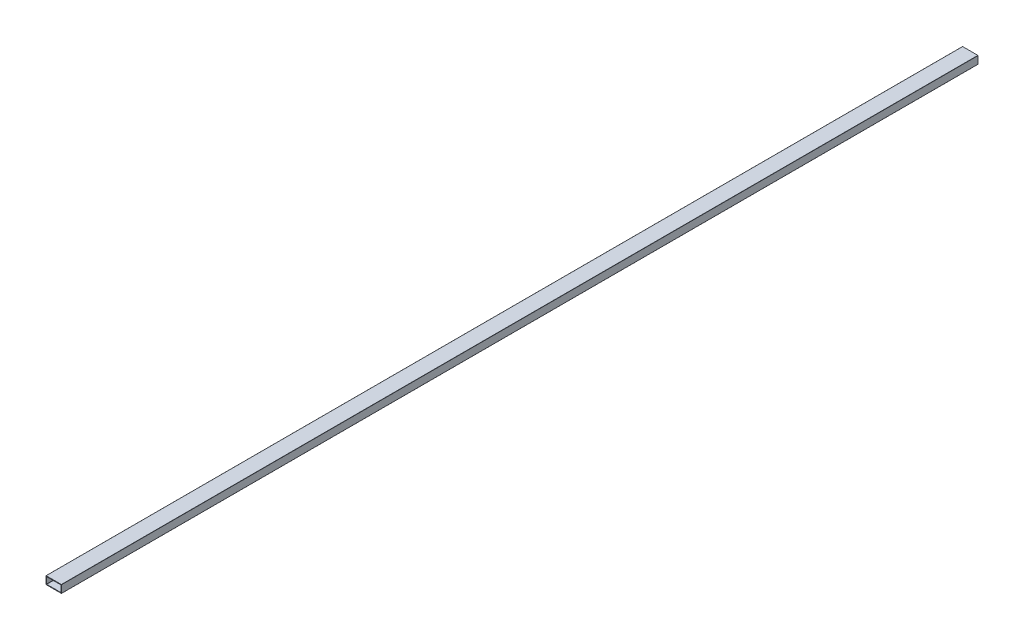
ISO-10303-21;
HEADER;
FILE_DESCRIPTION(('STEP AP214'),'2;1');
FILE_NAME('part.step','',(''),(''),'','','');
FILE_SCHEMA(('AUTOMOTIVE_DESIGN { 1 0 10303 214 1 1 1 1 }'));
ENDSEC;
DATA;
#1=APPLICATION_CONTEXT('core data for automotive mechanical design processes');
#2=APPLICATION_PROTOCOL_DEFINITION('international standard','automotive_design',2000,#1);
#3=PRODUCT_CONTEXT('',#1,'mechanical');
#4=PRODUCT('Part','Part','',(#3));
#5=PRODUCT_RELATED_PRODUCT_CATEGORY('part','',(#4));
#6=PRODUCT_DEFINITION_FORMATION('','',#4);
#7=PRODUCT_DEFINITION_CONTEXT('part definition',#1,'design');
#8=PRODUCT_DEFINITION('design','',#6,#7);
#9=PRODUCT_DEFINITION_SHAPE('','',#8);
#10=(LENGTH_UNIT() NAMED_UNIT(*) SI_UNIT(.MILLI.,.METRE.));
#11=(NAMED_UNIT(*) PLANE_ANGLE_UNIT() SI_UNIT($,.RADIAN.));
#12=(NAMED_UNIT(*) SI_UNIT($,.STERADIAN.) SOLID_ANGLE_UNIT());
#13=UNCERTAINTY_MEASURE_WITH_UNIT(LENGTH_MEASURE(1.E-05),#10,'distance_accuracy_value','');
#14=(GEOMETRIC_REPRESENTATION_CONTEXT(3) GLOBAL_UNCERTAINTY_ASSIGNED_CONTEXT((#13)) GLOBAL_UNIT_ASSIGNED_CONTEXT((#10,
#11,#12)) REPRESENTATION_CONTEXT('',''));
#15=CARTESIAN_POINT('',(0.,0.,0.));
#16=DIRECTION('',(0.,0.,1.));
#17=DIRECTION('',(1.,0.,0.));
#18=AXIS2_PLACEMENT_3D('',#15,#16,#17);
#19=CARTESIAN_POINT('',(50.8,-25.4,-6000.));
#20=DIRECTION('',(1.,0.,0.));
#21=DIRECTION('',(0.,0.,-1.));
#22=AXIS2_PLACEMENT_3D('',#19,#20,#21);
#23=PLANE('',#22);
#24=DIRECTION('',(0.,1.,0.));
#25=VECTOR('',#24,1.);
#26=CARTESIAN_POINT('',(50.8,-25.4,0.));
#27=LINE('',#26,#25);
#28=CARTESIAN_POINT('',(50.8,-24.4,0.));
#29=VERTEX_POINT('',#28);
#30=CARTESIAN_POINT('',(50.8,24.4,0.));
#31=VERTEX_POINT('',#30);
#32=EDGE_CURVE('E197',#29,#31,#27,.T.);
#33=ORIENTED_EDGE('',*,*,#32,.F.);
#34=DIRECTION('',(0.,0.,1.));
#35=VECTOR('',#34,1.);
#36=CARTESIAN_POINT('',(50.8,-24.4,-6000.));
#37=LINE('',#36,#35);
#38=CARTESIAN_POINT('',(50.8,-24.4,-6000.));
#39=VERTEX_POINT('',#38);
#40=EDGE_CURVE('E158',#29,#39,#37,.F.);
#41=ORIENTED_EDGE('',*,*,#40,.T.);
#42=DIRECTION('',(0.,1.,0.));
#43=VECTOR('',#42,1.);
#44=CARTESIAN_POINT('',(50.8,-25.4,-6000.));
#45=LINE('',#44,#43);
#46=CARTESIAN_POINT('',(50.8,24.4,-6000.));
#47=VERTEX_POINT('',#46);
#48=EDGE_CURVE('E185',#39,#47,#45,.T.);
#49=ORIENTED_EDGE('',*,*,#48,.T.);
#50=DIRECTION('',(0.,0.,1.));
#51=VECTOR('',#50,1.);
#52=CARTESIAN_POINT('',(50.8,24.4,-6000.));
#53=LINE('',#52,#51);
#54=EDGE_CURVE('E251',#47,#31,#53,.T.);
#55=ORIENTED_EDGE('',*,*,#54,.T.);
#56=EDGE_LOOP('',(#33,#41,#49,#55));
#57=FACE_BOUND('',#56,.T.);
#58=ADVANCED_FACE('F33',(#57),#23,.T.);
#59=CARTESIAN_POINT('',(-50.8,-25.4,-6000.));
#60=DIRECTION('',(0.,-1.,0.));
#61=DIRECTION('',(0.,0.,-1.));
#62=AXIS2_PLACEMENT_3D('',#59,#60,#61);
#63=PLANE('',#62);
#64=DIRECTION('',(1.,0.,0.));
#65=VECTOR('',#64,1.);
#66=CARTESIAN_POINT('',(-50.8,-25.4,0.));
#67=LINE('',#66,#65);
#68=CARTESIAN_POINT('',(-49.8,-25.4,0.));
#69=VERTEX_POINT('',#68);
#70=CARTESIAN_POINT('',(49.8,-25.4,0.));
#71=VERTEX_POINT('',#70);
#72=EDGE_CURVE('E189',#69,#71,#67,.T.);
#73=ORIENTED_EDGE('',*,*,#72,.F.);
#74=DIRECTION('',(0.,0.,1.));
#75=VECTOR('',#74,1.);
#76=CARTESIAN_POINT('',(-49.8,-25.4,-6000.));
#77=LINE('',#76,#75);
#78=CARTESIAN_POINT('',(-49.8,-25.4,-6000.));
#79=VERTEX_POINT('',#78);
#80=EDGE_CURVE('E238',#69,#79,#77,.F.);
#81=ORIENTED_EDGE('',*,*,#80,.T.);
#82=DIRECTION('',(1.,0.,0.));
#83=VECTOR('',#82,1.);
#84=CARTESIAN_POINT('',(-50.8,-25.4,-6000.));
#85=LINE('',#84,#83);
#86=CARTESIAN_POINT('',(49.8,-25.4,-6000.));
#87=VERTEX_POINT('',#86);
#88=EDGE_CURVE('E194',#79,#87,#85,.T.);
#89=ORIENTED_EDGE('',*,*,#88,.T.);
#90=DIRECTION('',(0.,0.,1.));
#91=VECTOR('',#90,1.);
#92=CARTESIAN_POINT('',(49.8,-25.4,-6000.));
#93=LINE('',#92,#91);
#94=EDGE_CURVE('E235',#87,#71,#93,.T.);
#95=ORIENTED_EDGE('',*,*,#94,.T.);
#96=EDGE_LOOP('',(#73,#81,#89,#95));
#97=FACE_BOUND('',#96,.T.);
#98=ADVANCED_FACE('F305',(#97),#63,.T.);
#99=CARTESIAN_POINT('',(-50.8,-25.4,-6000.));
#100=DIRECTION('',(-1.,0.,0.));
#101=DIRECTION('',(0.,0.,1.));
#102=AXIS2_PLACEMENT_3D('',#99,#100,#101);
#103=PLANE('',#102);
#104=DIRECTION('',(0.,-1.,0.));
#105=VECTOR('',#104,1.);
#106=CARTESIAN_POINT('',(-50.8,-25.4,-6000.));
#107=LINE('',#106,#105);
#108=CARTESIAN_POINT('',(-50.8,24.4,-6000.));
#109=VERTEX_POINT('',#108);
#110=CARTESIAN_POINT('',(-50.8,-24.4,-6000.));
#111=VERTEX_POINT('',#110);
#112=EDGE_CURVE('E191',#109,#111,#107,.T.);
#113=ORIENTED_EDGE('',*,*,#112,.T.);
#114=DIRECTION('',(0.,0.,1.));
#115=VECTOR('',#114,1.);
#116=CARTESIAN_POINT('',(-50.8,-24.4,-6000.));
#117=LINE('',#116,#115);
#118=CARTESIAN_POINT('',(-50.8,-24.4,0.));
#119=VERTEX_POINT('',#118);
#120=EDGE_CURVE('E224',#111,#119,#117,.T.);
#121=ORIENTED_EDGE('',*,*,#120,.T.);
#122=DIRECTION('',(0.,-1.,0.));
#123=VECTOR('',#122,1.);
#124=CARTESIAN_POINT('',(-50.8,-25.4,0.));
#125=LINE('',#124,#123);
#126=CARTESIAN_POINT('',(-50.8,24.4,0.));
#127=VERTEX_POINT('',#126);
#128=EDGE_CURVE('E203',#127,#119,#125,.T.);
#129=ORIENTED_EDGE('',*,*,#128,.F.);
#130=DIRECTION('',(0.,0.,1.));
#131=VECTOR('',#130,1.);
#132=CARTESIAN_POINT('',(-50.8,24.4,-6000.));
#133=LINE('',#132,#131);
#134=EDGE_CURVE('E222',#127,#109,#133,.F.);
#135=ORIENTED_EDGE('',*,*,#134,.T.);
#136=EDGE_LOOP('',(#113,#121,#129,#135));
#137=FACE_BOUND('',#136,.T.);
#138=ADVANCED_FACE('F311',(#137),#103,.T.);
#139=CARTESIAN_POINT('',(-50.8,25.4,-6000.));
#140=DIRECTION('',(0.,1.,0.));
#141=DIRECTION('',(0.,0.,1.));
#142=AXIS2_PLACEMENT_3D('',#139,#140,#141);
#143=PLANE('',#142);
#144=DIRECTION('',(-1.,0.,0.));
#145=VECTOR('',#144,1.);
#146=CARTESIAN_POINT('',(-50.8,25.4,-6000.));
#147=LINE('',#146,#145);
#148=CARTESIAN_POINT('',(49.8,25.4,-6000.));
#149=VERTEX_POINT('',#148);
#150=CARTESIAN_POINT('',(-49.8,25.4,-6000.));
#151=VERTEX_POINT('',#150);
#152=EDGE_CURVE('E188',#149,#151,#147,.T.);
#153=ORIENTED_EDGE('',*,*,#152,.T.);
#154=DIRECTION('',(0.,0.,1.));
#155=VECTOR('',#154,1.);
#156=CARTESIAN_POINT('',(-49.8,25.4,-6000.));
#157=LINE('',#156,#155);
#158=CARTESIAN_POINT('',(-49.8,25.4,0.));
#159=VERTEX_POINT('',#158);
#160=EDGE_CURVE('E248',#151,#159,#157,.T.);
#161=ORIENTED_EDGE('',*,*,#160,.T.);
#162=DIRECTION('',(-1.,0.,0.));
#163=VECTOR('',#162,1.);
#164=CARTESIAN_POINT('',(-50.8,25.4,0.));
#165=LINE('',#164,#163);
#166=CARTESIAN_POINT('',(49.8,25.4,0.));
#167=VERTEX_POINT('',#166);
#168=EDGE_CURVE('E200',#167,#159,#165,.T.);
#169=ORIENTED_EDGE('',*,*,#168,.F.);
#170=DIRECTION('',(0.,0.,1.));
#171=VECTOR('',#170,1.);
#172=CARTESIAN_POINT('',(49.8,25.4,-6000.));
#173=LINE('',#172,#171);
#174=EDGE_CURVE('E55',#167,#149,#173,.F.);
#175=ORIENTED_EDGE('',*,*,#174,.T.);
#176=EDGE_LOOP('',(#153,#161,#169,#175));
#177=FACE_BOUND('',#176,.T.);
#178=ADVANCED_FACE('F316',(#177),#143,.T.);
#179=CARTESIAN_POINT('',(0.,0.,-6000.));
#180=DIRECTION('',(0.,0.,-1.));
#181=DIRECTION('',(-1.,0.,0.));
#182=AXIS2_PLACEMENT_3D('',#179,#180,#181);
#183=PLANE('',#182);
#184=DIRECTION('',(0.,-1.,0.));
#185=VECTOR('',#184,1.);
#186=CARTESIAN_POINT('',(-47.,-21.6,-6000.));
#187=LINE('',#186,#185);
#188=CARTESIAN_POINT('',(-47.,20.6,-6000.));
#189=VERTEX_POINT('',#188);
#190=CARTESIAN_POINT('',(-47.,-20.6,-6000.));
#191=VERTEX_POINT('',#190);
#192=EDGE_CURVE('E167',#189,#191,#187,.T.);
#193=ORIENTED_EDGE('',*,*,#192,.T.);
#194=CARTESIAN_POINT('',(-46.,-20.6,-6000.));
#195=DIRECTION('',(0.,0.,-1.));
#196=DIRECTION('',(-1.,0.,0.));
#197=AXIS2_PLACEMENT_3D('',#194,#195,#196);
#198=CIRCLE('',#197,1.);
#199=CARTESIAN_POINT('',(-46.,-21.6,-6000.));
#200=VERTEX_POINT('',#199);
#201=EDGE_CURVE('E11',#191,#200,#198,.F.);
#202=ORIENTED_EDGE('',*,*,#201,.T.);
#203=DIRECTION('',(1.,0.,0.));
#204=VECTOR('',#203,1.);
#205=CARTESIAN_POINT('',(-47.,-21.6,-6000.));
#206=LINE('',#205,#204);
#207=CARTESIAN_POINT('',(46.,-21.6,-6000.));
#208=VERTEX_POINT('',#207);
#209=EDGE_CURVE('E175',#200,#208,#206,.T.);
#210=ORIENTED_EDGE('',*,*,#209,.T.);
#211=CARTESIAN_POINT('',(46.,-20.6,-6000.));
#212=DIRECTION('',(0.,0.,-1.));
#213=DIRECTION('',(-1.,0.,0.));
#214=AXIS2_PLACEMENT_3D('',#211,#212,#213);
#215=CIRCLE('',#214,1.);
#216=CARTESIAN_POINT('',(47.,-20.6,-6000.));
#217=VERTEX_POINT('',#216);
#218=EDGE_CURVE('E262',#208,#217,#215,.F.);
#219=ORIENTED_EDGE('',*,*,#218,.T.);
#220=DIRECTION('',(0.,1.,0.));
#221=VECTOR('',#220,1.);
#222=CARTESIAN_POINT('',(47.,-21.6,-6000.));
#223=LINE('',#222,#221);
#224=CARTESIAN_POINT('',(47.,20.6,-6000.));
#225=VERTEX_POINT('',#224);
#226=EDGE_CURVE('E179',#217,#225,#223,.T.);
#227=ORIENTED_EDGE('',*,*,#226,.T.);
#228=CARTESIAN_POINT('',(46.,20.6,-6000.));
#229=DIRECTION('',(0.,0.,-1.));
#230=DIRECTION('',(-1.,0.,0.));
#231=AXIS2_PLACEMENT_3D('',#228,#229,#230);
#232=CIRCLE('',#231,1.);
#233=CARTESIAN_POINT('',(46.,21.6,-6000.));
#234=VERTEX_POINT('',#233);
#235=EDGE_CURVE('E258',#225,#234,#232,.F.);
#236=ORIENTED_EDGE('',*,*,#235,.T.);
#237=DIRECTION('',(-1.,0.,0.));
#238=VECTOR('',#237,1.);
#239=CARTESIAN_POINT('',(-47.,21.6,-6000.));
#240=LINE('',#239,#238);
#241=CARTESIAN_POINT('',(-46.,21.6,-6000.));
#242=VERTEX_POINT('',#241);
#243=EDGE_CURVE('E277',#234,#242,#240,.T.);
#244=ORIENTED_EDGE('',*,*,#243,.T.);
#245=CARTESIAN_POINT('',(-46.,20.6,-6000.));
#246=DIRECTION('',(0.,0.,-1.));
#247=DIRECTION('',(-1.,0.,0.));
#248=AXIS2_PLACEMENT_3D('',#245,#246,#247);
#249=CIRCLE('',#248,1.);
#250=EDGE_CURVE('E157',#242,#189,#249,.F.);
#251=ORIENTED_EDGE('',*,*,#250,.T.);
#252=EDGE_LOOP('',(#193,#202,#210,#219,#227,#236,#244,#251));
#253=FACE_BOUND('',#252,.T.);
#254=ORIENTED_EDGE('',*,*,#88,.F.);
#255=CARTESIAN_POINT('',(-49.8,-24.4,-6000.));
#256=DIRECTION('',(0.,0.,-1.));
#257=DIRECTION('',(-1.,0.,0.));
#258=AXIS2_PLACEMENT_3D('',#255,#256,#257);
#259=CIRCLE('',#258,1.);
#260=EDGE_CURVE('E245',#79,#111,#259,.T.);
#261=ORIENTED_EDGE('',*,*,#260,.T.);
#262=ORIENTED_EDGE('',*,*,#112,.F.);
#263=CARTESIAN_POINT('',(-49.8,24.4,-6000.));
#264=DIRECTION('',(0.,0.,-1.));
#265=DIRECTION('',(-1.,0.,0.));
#266=AXIS2_PLACEMENT_3D('',#263,#264,#265);
#267=CIRCLE('',#266,1.);
#268=EDGE_CURVE('E48',#109,#151,#267,.T.);
#269=ORIENTED_EDGE('',*,*,#268,.T.);
#270=ORIENTED_EDGE('',*,*,#152,.F.);
#271=CARTESIAN_POINT('',(49.8,24.4,-6000.));
#272=DIRECTION('',(0.,0.,-1.));
#273=DIRECTION('',(-1.,0.,0.));
#274=AXIS2_PLACEMENT_3D('',#271,#272,#273);
#275=CIRCLE('',#274,1.);
#276=EDGE_CURVE('E240',#149,#47,#275,.T.);
#277=ORIENTED_EDGE('',*,*,#276,.T.);
#278=ORIENTED_EDGE('',*,*,#48,.F.);
#279=CARTESIAN_POINT('',(49.8,-24.4,-6000.));
#280=DIRECTION('',(0.,0.,-1.));
#281=DIRECTION('',(-1.,0.,0.));
#282=AXIS2_PLACEMENT_3D('',#279,#280,#281);
#283=CIRCLE('',#282,1.);
#284=EDGE_CURVE('E242',#39,#87,#283,.T.);
#285=ORIENTED_EDGE('',*,*,#284,.T.);
#286=EDGE_LOOP('',(#254,#261,#262,#269,#270,#277,#278,#285));
#287=FACE_BOUND('',#286,.T.);
#288=ADVANCED_FACE('F267',(#253,#287),#183,.T.);
#289=CARTESIAN_POINT('',(0.,0.,0.));
#290=DIRECTION('',(0.,0.,-1.));
#291=DIRECTION('',(-1.,0.,0.));
#292=AXIS2_PLACEMENT_3D('',#289,#290,#291);
#293=PLANE('',#292);
#294=DIRECTION('',(0.,1.,0.));
#295=VECTOR('',#294,1.);
#296=CARTESIAN_POINT('',(47.,-21.6,0.));
#297=LINE('',#296,#295);
#298=CARTESIAN_POINT('',(47.,-20.6,0.));
#299=VERTEX_POINT('',#298);
#300=CARTESIAN_POINT('',(47.,20.6,0.));
#301=VERTEX_POINT('',#300);
#302=EDGE_CURVE('E181',#299,#301,#297,.T.);
#303=ORIENTED_EDGE('',*,*,#302,.F.);
#304=CARTESIAN_POINT('',(46.,-20.6,0.));
#305=DIRECTION('',(0.,0.,-1.));
#306=DIRECTION('',(-1.,0.,0.));
#307=AXIS2_PLACEMENT_3D('',#304,#305,#306);
#308=CIRCLE('',#307,1.);
#309=CARTESIAN_POINT('',(46.,-21.6,0.));
#310=VERTEX_POINT('',#309);
#311=EDGE_CURVE('E260',#299,#310,#308,.T.);
#312=ORIENTED_EDGE('',*,*,#311,.T.);
#313=DIRECTION('',(1.,0.,0.));
#314=VECTOR('',#313,1.);
#315=CARTESIAN_POINT('',(-47.,-21.6,0.));
#316=LINE('',#315,#314);
#317=CARTESIAN_POINT('',(-46.,-21.6,0.));
#318=VERTEX_POINT('',#317);
#319=EDGE_CURVE('E281',#318,#310,#316,.T.);
#320=ORIENTED_EDGE('',*,*,#319,.F.);
#321=CARTESIAN_POINT('',(-46.,-20.6,0.));
#322=DIRECTION('',(0.,0.,-1.));
#323=DIRECTION('',(-1.,0.,0.));
#324=AXIS2_PLACEMENT_3D('',#321,#322,#323);
#325=CIRCLE('',#324,1.);
#326=CARTESIAN_POINT('',(-47.,-20.6,0.));
#327=VERTEX_POINT('',#326);
#328=EDGE_CURVE('E41',#318,#327,#325,.T.);
#329=ORIENTED_EDGE('',*,*,#328,.T.);
#330=DIRECTION('',(0.,-1.,0.));
#331=VECTOR('',#330,1.);
#332=CARTESIAN_POINT('',(-47.,-21.6,0.));
#333=LINE('',#332,#331);
#334=CARTESIAN_POINT('',(-47.,20.6,0.));
#335=VERTEX_POINT('',#334);
#336=EDGE_CURVE('E164',#335,#327,#333,.T.);
#337=ORIENTED_EDGE('',*,*,#336,.F.);
#338=CARTESIAN_POINT('',(-46.,20.6,0.));
#339=DIRECTION('',(0.,0.,-1.));
#340=DIRECTION('',(-1.,0.,0.));
#341=AXIS2_PLACEMENT_3D('',#338,#339,#340);
#342=CIRCLE('',#341,1.);
#343=CARTESIAN_POINT('',(-46.,21.6,0.));
#344=VERTEX_POINT('',#343);
#345=EDGE_CURVE('E147',#335,#344,#342,.T.);
#346=ORIENTED_EDGE('',*,*,#345,.T.);
#347=DIRECTION('',(-1.,0.,0.));
#348=VECTOR('',#347,1.);
#349=CARTESIAN_POINT('',(-47.,21.6,0.));
#350=LINE('',#349,#348);
#351=CARTESIAN_POINT('',(46.,21.6,0.));
#352=VERTEX_POINT('',#351);
#353=EDGE_CURVE('E176',#352,#344,#350,.T.);
#354=ORIENTED_EDGE('',*,*,#353,.F.);
#355=CARTESIAN_POINT('',(46.,20.6,0.));
#356=DIRECTION('',(0.,0.,-1.));
#357=DIRECTION('',(-1.,0.,0.));
#358=AXIS2_PLACEMENT_3D('',#355,#356,#357);
#359=CIRCLE('',#358,1.);
#360=EDGE_CURVE('E256',#352,#301,#359,.T.);
#361=ORIENTED_EDGE('',*,*,#360,.T.);
#362=EDGE_LOOP('',(#303,#312,#320,#329,#337,#346,#354,#361));
#363=FACE_BOUND('',#362,.T.);
#364=ORIENTED_EDGE('',*,*,#128,.T.);
#365=CARTESIAN_POINT('',(-49.8,-24.4,0.));
#366=DIRECTION('',(0.,0.,-1.));
#367=DIRECTION('',(-1.,0.,0.));
#368=AXIS2_PLACEMENT_3D('',#365,#366,#367);
#369=CIRCLE('',#368,1.);
#370=EDGE_CURVE('E233',#119,#69,#369,.F.);
#371=ORIENTED_EDGE('',*,*,#370,.T.);
#372=ORIENTED_EDGE('',*,*,#72,.T.);
#373=CARTESIAN_POINT('',(49.8,-24.4,0.));
#374=DIRECTION('',(0.,0.,-1.));
#375=DIRECTION('',(-1.,0.,0.));
#376=AXIS2_PLACEMENT_3D('',#373,#374,#375);
#377=CIRCLE('',#376,1.);
#378=EDGE_CURVE('E229',#71,#29,#377,.F.);
#379=ORIENTED_EDGE('',*,*,#378,.T.);
#380=ORIENTED_EDGE('',*,*,#32,.T.);
#381=CARTESIAN_POINT('',(49.8,24.4,0.));
#382=DIRECTION('',(0.,0.,-1.));
#383=DIRECTION('',(-1.,0.,0.));
#384=AXIS2_PLACEMENT_3D('',#381,#382,#383);
#385=CIRCLE('',#384,1.);
#386=EDGE_CURVE('E227',#31,#167,#385,.F.);
#387=ORIENTED_EDGE('',*,*,#386,.T.);
#388=ORIENTED_EDGE('',*,*,#168,.T.);
#389=CARTESIAN_POINT('',(-49.8,24.4,0.));
#390=DIRECTION('',(0.,0.,-1.));
#391=DIRECTION('',(-1.,0.,0.));
#392=AXIS2_PLACEMENT_3D('',#389,#390,#391);
#393=CIRCLE('',#392,1.);
#394=EDGE_CURVE('E231',#159,#127,#393,.F.);
#395=ORIENTED_EDGE('',*,*,#394,.T.);
#396=EDGE_LOOP('',(#364,#371,#372,#379,#380,#387,#388,#395));
#397=FACE_BOUND('',#396,.T.);
#398=ADVANCED_FACE('F172',(#363,#397),#293,.F.);
#399=CARTESIAN_POINT('',(-47.,-21.6,-6000.));
#400=DIRECTION('',(0.,-1.,0.));
#401=DIRECTION('',(0.,0.,-1.));
#402=AXIS2_PLACEMENT_3D('',#399,#400,#401);
#403=PLANE('',#402);
#404=ORIENTED_EDGE('',*,*,#319,.T.);
#405=DIRECTION('',(0.,0.,1.));
#406=VECTOR('',#405,1.);
#407=CARTESIAN_POINT('',(46.,-21.6,-6000.));
#408=LINE('',#407,#406);
#409=EDGE_CURVE('E220',#310,#208,#408,.F.);
#410=ORIENTED_EDGE('',*,*,#409,.T.);
#411=ORIENTED_EDGE('',*,*,#209,.F.);
#412=DIRECTION('',(0.,0.,1.));
#413=VECTOR('',#412,1.);
#414=CARTESIAN_POINT('',(-46.,-21.6,0.));
#415=LINE('',#414,#413);
#416=EDGE_CURVE('E217',#200,#318,#415,.T.);
#417=ORIENTED_EDGE('',*,*,#416,.T.);
#418=EDGE_LOOP('',(#404,#410,#411,#417));
#419=FACE_BOUND('',#418,.T.);
#420=ADVANCED_FACE('F283',(#419),#403,.F.);
#421=CARTESIAN_POINT('',(-47.,-21.6,-6000.));
#422=DIRECTION('',(-1.,0.,0.));
#423=DIRECTION('',(0.,0.,1.));
#424=AXIS2_PLACEMENT_3D('',#421,#422,#423);
#425=PLANE('',#424);
#426=ORIENTED_EDGE('',*,*,#192,.F.);
#427=DIRECTION('',(0.,0.,1.));
#428=VECTOR('',#427,1.);
#429=CARTESIAN_POINT('',(-47.,20.6,0.));
#430=LINE('',#429,#428);
#431=EDGE_CURVE('E151',#189,#335,#430,.T.);
#432=ORIENTED_EDGE('',*,*,#431,.T.);
#433=ORIENTED_EDGE('',*,*,#336,.T.);
#434=DIRECTION('',(0.,0.,1.));
#435=VECTOR('',#434,1.);
#436=CARTESIAN_POINT('',(-47.,-20.6,-6000.));
#437=LINE('',#436,#435);
#438=EDGE_CURVE('E169',#327,#191,#437,.F.);
#439=ORIENTED_EDGE('',*,*,#438,.T.);
#440=EDGE_LOOP('',(#426,#432,#433,#439));
#441=FACE_BOUND('',#440,.T.);
#442=ADVANCED_FACE('F163',(#441),#425,.F.);
#443=CARTESIAN_POINT('',(-47.,21.6,-6000.));
#444=DIRECTION('',(0.,1.,0.));
#445=DIRECTION('',(-1.,0.,0.));
#446=AXIS2_PLACEMENT_3D('',#443,#444,#445);
#447=PLANE('',#446);
#448=ORIENTED_EDGE('',*,*,#353,.T.);
#449=DIRECTION('',(0.,0.,1.));
#450=VECTOR('',#449,1.);
#451=CARTESIAN_POINT('',(-46.,21.6,-6000.));
#452=LINE('',#451,#450);
#453=EDGE_CURVE('E152',#344,#242,#452,.F.);
#454=ORIENTED_EDGE('',*,*,#453,.T.);
#455=ORIENTED_EDGE('',*,*,#243,.F.);
#456=DIRECTION('',(0.,0.,1.));
#457=VECTOR('',#456,1.);
#458=CARTESIAN_POINT('',(46.,21.6,0.));
#459=LINE('',#458,#457);
#460=EDGE_CURVE('E168',#234,#352,#459,.T.);
#461=ORIENTED_EDGE('',*,*,#460,.T.);
#462=EDGE_LOOP('',(#448,#454,#455,#461));
#463=FACE_BOUND('',#462,.T.);
#464=ADVANCED_FACE('F292',(#463),#447,.F.);
#465=CARTESIAN_POINT('',(47.,-21.6,-6000.));
#466=DIRECTION('',(1.,0.,0.));
#467=DIRECTION('',(0.,0.,-1.));
#468=AXIS2_PLACEMENT_3D('',#465,#466,#467);
#469=PLANE('',#468);
#470=ORIENTED_EDGE('',*,*,#302,.T.);
#471=DIRECTION('',(0.,0.,1.));
#472=VECTOR('',#471,1.);
#473=CARTESIAN_POINT('',(47.,20.6,-6000.));
#474=LINE('',#473,#472);
#475=EDGE_CURVE('E215',#301,#225,#474,.F.);
#476=ORIENTED_EDGE('',*,*,#475,.T.);
#477=ORIENTED_EDGE('',*,*,#226,.F.);
#478=DIRECTION('',(0.,0.,1.));
#479=VECTOR('',#478,1.);
#480=CARTESIAN_POINT('',(47.,-20.6,0.));
#481=LINE('',#480,#479);
#482=EDGE_CURVE('E212',#217,#299,#481,.T.);
#483=ORIENTED_EDGE('',*,*,#482,.T.);
#484=EDGE_LOOP('',(#470,#476,#477,#483));
#485=FACE_BOUND('',#484,.T.);
#486=ADVANCED_FACE('F275',(#485),#469,.F.);
#487=CARTESIAN_POINT('',(-46.,20.6,-6000.));
#488=DIRECTION('',(0.,0.,-1.));
#489=DIRECTION('',(-1.,0.,0.));
#490=AXIS2_PLACEMENT_3D('',#487,#488,#489);
#491=CYLINDRICAL_SURFACE('',#490,1.);
#492=ORIENTED_EDGE('',*,*,#250,.F.);
#493=ORIENTED_EDGE('',*,*,#453,.F.);
#494=ORIENTED_EDGE('',*,*,#345,.F.);
#495=ORIENTED_EDGE('',*,*,#431,.F.);
#496=EDGE_LOOP('',(#492,#493,#494,#495));
#497=FACE_BOUND('',#496,.T.);
#498=ADVANCED_FACE('F150',(#497),#491,.F.);
#499=CARTESIAN_POINT('',(46.,20.6,-6000.));
#500=DIRECTION('',(0.,0.,-1.));
#501=DIRECTION('',(-1.,0.,0.));
#502=AXIS2_PLACEMENT_3D('',#499,#500,#501);
#503=CYLINDRICAL_SURFACE('',#502,1.);
#504=ORIENTED_EDGE('',*,*,#235,.F.);
#505=ORIENTED_EDGE('',*,*,#475,.F.);
#506=ORIENTED_EDGE('',*,*,#360,.F.);
#507=ORIENTED_EDGE('',*,*,#460,.F.);
#508=EDGE_LOOP('',(#504,#505,#506,#507));
#509=FACE_BOUND('',#508,.T.);
#510=ADVANCED_FACE('F294',(#509),#503,.F.);
#511=CARTESIAN_POINT('',(46.,-20.6,-6000.));
#512=DIRECTION('',(0.,0.,-1.));
#513=DIRECTION('',(-1.,0.,0.));
#514=AXIS2_PLACEMENT_3D('',#511,#512,#513);
#515=CYLINDRICAL_SURFACE('',#514,1.);
#516=ORIENTED_EDGE('',*,*,#218,.F.);
#517=ORIENTED_EDGE('',*,*,#409,.F.);
#518=ORIENTED_EDGE('',*,*,#311,.F.);
#519=ORIENTED_EDGE('',*,*,#482,.F.);
#520=EDGE_LOOP('',(#516,#517,#518,#519));
#521=FACE_BOUND('',#520,.T.);
#522=ADVANCED_FACE('F279',(#521),#515,.F.);
#523=CARTESIAN_POINT('',(-49.8,-24.4,-6000.));
#524=DIRECTION('',(0.,0.,1.));
#525=DIRECTION('',(1.,0.,0.));
#526=AXIS2_PLACEMENT_3D('',#523,#524,#525);
#527=CYLINDRICAL_SURFACE('',#526,1.);
#528=ORIENTED_EDGE('',*,*,#260,.F.);
#529=ORIENTED_EDGE('',*,*,#80,.F.);
#530=ORIENTED_EDGE('',*,*,#370,.F.);
#531=ORIENTED_EDGE('',*,*,#120,.F.);
#532=EDGE_LOOP('',(#528,#529,#530,#531));
#533=FACE_BOUND('',#532,.T.);
#534=ADVANCED_FACE('F301',(#533),#527,.T.);
#535=CARTESIAN_POINT('',(-49.8,24.4,-6000.));
#536=DIRECTION('',(0.,0.,1.));
#537=DIRECTION('',(1.,0.,0.));
#538=AXIS2_PLACEMENT_3D('',#535,#536,#537);
#539=CYLINDRICAL_SURFACE('',#538,1.);
#540=ORIENTED_EDGE('',*,*,#268,.F.);
#541=ORIENTED_EDGE('',*,*,#134,.F.);
#542=ORIENTED_EDGE('',*,*,#394,.F.);
#543=ORIENTED_EDGE('',*,*,#160,.F.);
#544=EDGE_LOOP('',(#540,#541,#542,#543));
#545=FACE_BOUND('',#544,.T.);
#546=ADVANCED_FACE('F368',(#545),#539,.T.);
#547=CARTESIAN_POINT('',(-46.,-20.6,-6000.));
#548=DIRECTION('',(0.,0.,-1.));
#549=DIRECTION('',(-1.,0.,0.));
#550=AXIS2_PLACEMENT_3D('',#547,#548,#549);
#551=CYLINDRICAL_SURFACE('',#550,1.);
#552=ORIENTED_EDGE('',*,*,#201,.F.);
#553=ORIENTED_EDGE('',*,*,#438,.F.);
#554=ORIENTED_EDGE('',*,*,#328,.F.);
#555=ORIENTED_EDGE('',*,*,#416,.F.);
#556=EDGE_LOOP('',(#552,#553,#554,#555));
#557=FACE_BOUND('',#556,.T.);
#558=ADVANCED_FACE('F378',(#557),#551,.F.);
#559=CARTESIAN_POINT('',(49.8,-24.4,-6000.));
#560=DIRECTION('',(0.,0.,1.));
#561=DIRECTION('',(1.,0.,0.));
#562=AXIS2_PLACEMENT_3D('',#559,#560,#561);
#563=CYLINDRICAL_SURFACE('',#562,1.);
#564=ORIENTED_EDGE('',*,*,#284,.F.);
#565=ORIENTED_EDGE('',*,*,#40,.F.);
#566=ORIENTED_EDGE('',*,*,#378,.F.);
#567=ORIENTED_EDGE('',*,*,#94,.F.);
#568=EDGE_LOOP('',(#564,#565,#566,#567));
#569=FACE_BOUND('',#568,.T.);
#570=ADVANCED_FACE('F388',(#569),#563,.T.);
#571=CARTESIAN_POINT('',(49.8,24.4,-6000.));
#572=DIRECTION('',(0.,0.,1.));
#573=DIRECTION('',(1.,0.,0.));
#574=AXIS2_PLACEMENT_3D('',#571,#572,#573);
#575=CYLINDRICAL_SURFACE('',#574,1.);
#576=ORIENTED_EDGE('',*,*,#276,.F.);
#577=ORIENTED_EDGE('',*,*,#174,.F.);
#578=ORIENTED_EDGE('',*,*,#386,.F.);
#579=ORIENTED_EDGE('',*,*,#54,.F.);
#580=EDGE_LOOP('',(#576,#577,#578,#579));
#581=FACE_BOUND('',#580,.T.);
#582=ADVANCED_FACE('F35',(#581),#575,.T.);
#583=CLOSED_SHELL('',(#58,#98,#138,#178,#288,#398,#420,#442,#464,#486,#498,#510,#522,#534,#546,
#558,#570,#582));
#584=MANIFOLD_SOLID_BREP('B2',#583);
#585=ADVANCED_BREP_SHAPE_REPRESENTATION('',(#18,#584),#14);
#586=SHAPE_DEFINITION_REPRESENTATION(#9,#585);
ENDSEC;
END-ISO-10303-21;
